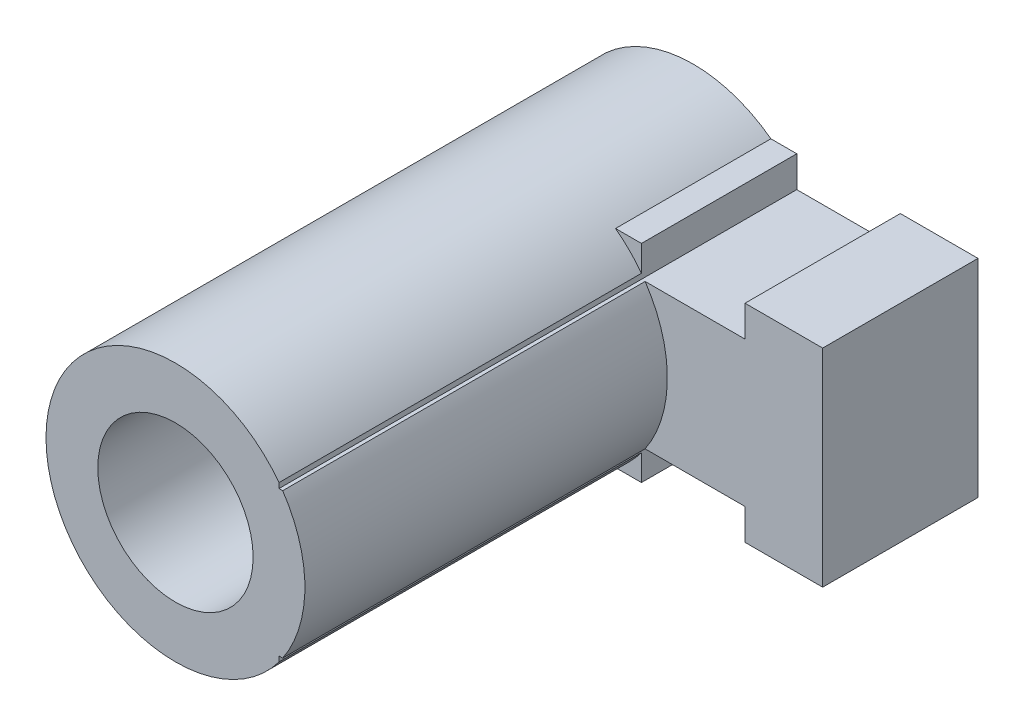
ISO-10303-21;
HEADER;
FILE_DESCRIPTION(('STEP AP214'),'2;1');
FILE_NAME('part.step','',(''),(''),'','','');
FILE_SCHEMA(('AUTOMOTIVE_DESIGN { 1 0 10303 214 1 1 1 1 }'));
ENDSEC;
DATA;
#1=APPLICATION_CONTEXT('core data for automotive mechanical design processes');
#2=APPLICATION_PROTOCOL_DEFINITION('international standard','automotive_design',2000,#1);
#3=PRODUCT_CONTEXT('',#1,'mechanical');
#4=PRODUCT('Part','Part','',(#3));
#5=PRODUCT_RELATED_PRODUCT_CATEGORY('part','',(#4));
#6=PRODUCT_DEFINITION_FORMATION('','',#4);
#7=PRODUCT_DEFINITION_CONTEXT('part definition',#1,'design');
#8=PRODUCT_DEFINITION('design','',#6,#7);
#9=PRODUCT_DEFINITION_SHAPE('','',#8);
#10=(LENGTH_UNIT() NAMED_UNIT(*) SI_UNIT(.MILLI.,.METRE.));
#11=(NAMED_UNIT(*) PLANE_ANGLE_UNIT() SI_UNIT($,.RADIAN.));
#12=(NAMED_UNIT(*) SI_UNIT($,.STERADIAN.) SOLID_ANGLE_UNIT());
#13=UNCERTAINTY_MEASURE_WITH_UNIT(LENGTH_MEASURE(1.E-05),#10,'distance_accuracy_value','');
#14=(GEOMETRIC_REPRESENTATION_CONTEXT(3) GLOBAL_UNCERTAINTY_ASSIGNED_CONTEXT((#13)) GLOBAL_UNIT_ASSIGNED_CONTEXT((#10,
#11,#12)) REPRESENTATION_CONTEXT('',''));
#15=CARTESIAN_POINT('',(0.,0.,0.));
#16=DIRECTION('',(0.,0.,1.));
#17=DIRECTION('',(1.,0.,0.));
#18=AXIS2_PLACEMENT_3D('',#15,#16,#17);
#19=CARTESIAN_POINT('',(0.,0.,3.));
#20=DIRECTION('',(0.,0.,-1.));
#21=DIRECTION('',(-1.,0.,0.));
#22=AXIS2_PLACEMENT_3D('',#19,#20,#21);
#23=PLANE('',#22);
#24=CARTESIAN_POINT('',(0.,0.,3.));
#25=DIRECTION('',(0.,0.,-1.));
#26=DIRECTION('',(-1.,0.,0.));
#27=AXIS2_PLACEMENT_3D('',#24,#25,#26);
#28=CIRCLE('',#27,2.5);
#29=CARTESIAN_POINT('',(1.5,2.,3.));
#30=VERTEX_POINT('',#29);
#31=CARTESIAN_POINT('',(2.,1.5,3.));
#32=VERTEX_POINT('',#31);
#33=EDGE_CURVE('E249',#30,#32,#28,.T.);
#34=ORIENTED_EDGE('',*,*,#33,.T.);
#35=DIRECTION('',(0.,1.,0.));
#36=VECTOR('',#35,1.);
#37=CARTESIAN_POINT('',(2.,0.,3.));
#38=LINE('',#37,#36);
#39=CARTESIAN_POINT('',(2.,2.,3.));
#40=VERTEX_POINT('',#39);
#41=EDGE_CURVE('E180',#32,#40,#38,.T.);
#42=ORIENTED_EDGE('',*,*,#41,.T.);
#43=DIRECTION('',(1.,0.,0.));
#44=VECTOR('',#43,1.);
#45=CARTESIAN_POINT('',(1.5,2.,3.));
#46=LINE('',#45,#44);
#47=EDGE_CURVE('E216',#30,#40,#46,.T.);
#48=ORIENTED_EDGE('',*,*,#47,.F.);
#49=EDGE_LOOP('',(#34,#42,#48));
#50=FACE_BOUND('',#49,.T.);
#51=ADVANCED_FACE('F35',(#50),#23,.F.);
#52=CARTESIAN_POINT('',(0.,0.,10.));
#53=DIRECTION('',(0.,0.,-1.));
#54=DIRECTION('',(-1.,0.,0.));
#55=AXIS2_PLACEMENT_3D('',#52,#53,#54);
#56=CYLINDRICAL_SURFACE('',#55,2.5);
#57=CARTESIAN_POINT('',(0.,0.,10.));
#58=DIRECTION('',(0.,0.,1.));
#59=DIRECTION('',(1.,0.,0.));
#60=AXIS2_PLACEMENT_3D('',#57,#58,#59);
#61=CIRCLE('',#60,2.5);
#62=CARTESIAN_POINT('',(2.,1.5,10.));
#63=VERTEX_POINT('',#62);
#64=CARTESIAN_POINT('',(2.,-1.5,10.));
#65=VERTEX_POINT('',#64);
#66=EDGE_CURVE('E262',#63,#65,#61,.T.);
#67=ORIENTED_EDGE('',*,*,#66,.F.);
#68=DIRECTION('',(0.,0.,-1.));
#69=VECTOR('',#68,1.);
#70=CARTESIAN_POINT('',(2.,1.5,10.));
#71=LINE('',#70,#69);
#72=EDGE_CURVE('E155',#63,#32,#71,.T.);
#73=ORIENTED_EDGE('',*,*,#72,.T.);
#74=ORIENTED_EDGE('',*,*,#33,.F.);
#75=DIRECTION('',(0.,0.,-1.));
#76=VECTOR('',#75,1.);
#77=CARTESIAN_POINT('',(1.5,2.,3.));
#78=LINE('',#77,#76);
#79=CARTESIAN_POINT('',(1.5,2.,0.));
#80=VERTEX_POINT('',#79);
#81=EDGE_CURVE('E227',#30,#80,#78,.T.);
#82=ORIENTED_EDGE('',*,*,#81,.T.);
#83=CARTESIAN_POINT('',(0.,0.,0.));
#84=DIRECTION('',(0.,0.,1.));
#85=DIRECTION('',(1.,0.,0.));
#86=AXIS2_PLACEMENT_3D('',#83,#84,#85);
#87=CIRCLE('',#86,2.5);
#88=CARTESIAN_POINT('',(1.5,-2.,0.));
#89=VERTEX_POINT('',#88);
#90=EDGE_CURVE('E257',#80,#89,#87,.T.);
#91=ORIENTED_EDGE('',*,*,#90,.T.);
#92=DIRECTION('',(0.,0.,-1.));
#93=VECTOR('',#92,1.);
#94=CARTESIAN_POINT('',(1.5,-2.,3.));
#95=LINE('',#94,#93);
#96=CARTESIAN_POINT('',(1.5,-2.,3.));
#97=VERTEX_POINT('',#96);
#98=EDGE_CURVE('E238',#97,#89,#95,.T.);
#99=ORIENTED_EDGE('',*,*,#98,.F.);
#100=CARTESIAN_POINT('',(2.,-1.5,3.));
#101=VERTEX_POINT('',#100);
#102=EDGE_CURVE('E241',#101,#97,#28,.T.);
#103=ORIENTED_EDGE('',*,*,#102,.F.);
#104=DIRECTION('',(0.,0.,-1.));
#105=VECTOR('',#104,1.);
#106=CARTESIAN_POINT('',(2.,-1.5,10.));
#107=LINE('',#106,#105);
#108=EDGE_CURVE('E58',#101,#65,#107,.F.);
#109=ORIENTED_EDGE('',*,*,#108,.T.);
#110=EDGE_LOOP('',(#67,#73,#74,#82,#91,#99,#103,#109));
#111=FACE_BOUND('',#110,.T.);
#112=ADVANCED_FACE('F312',(#111),#56,.T.);
#113=CARTESIAN_POINT('',(1.5,2.,3.));
#114=DIRECTION('',(0.,1.,0.));
#115=DIRECTION('',(-1.,0.,0.));
#116=AXIS2_PLACEMENT_3D('',#113,#114,#115);
#117=PLANE('',#116);
#118=DIRECTION('',(0.,0.,-1.));
#119=VECTOR('',#118,1.);
#120=CARTESIAN_POINT('',(4.,2.,3.));
#121=LINE('',#120,#119);
#122=CARTESIAN_POINT('',(4.,2.,3.));
#123=VERTEX_POINT('',#122);
#124=CARTESIAN_POINT('',(4.,2.,0.));
#125=VERTEX_POINT('',#124);
#126=EDGE_CURVE('E43',#123,#125,#121,.T.);
#127=ORIENTED_EDGE('',*,*,#126,.F.);
#128=CARTESIAN_POINT('',(5.5,2.,3.));
#129=VERTEX_POINT('',#128);
#130=EDGE_CURVE('E220',#123,#129,#46,.T.);
#131=ORIENTED_EDGE('',*,*,#130,.T.);
#132=DIRECTION('',(0.,0.,-1.));
#133=VECTOR('',#132,1.);
#134=CARTESIAN_POINT('',(5.5,2.,3.));
#135=LINE('',#134,#133);
#136=CARTESIAN_POINT('',(5.5,2.,0.));
#137=VERTEX_POINT('',#136);
#138=EDGE_CURVE('E244',#129,#137,#135,.T.);
#139=ORIENTED_EDGE('',*,*,#138,.T.);
#140=DIRECTION('',(1.,0.,0.));
#141=VECTOR('',#140,1.);
#142=CARTESIAN_POINT('',(1.5,2.,0.));
#143=LINE('',#142,#141);
#144=EDGE_CURVE('E215',#125,#137,#143,.T.);
#145=ORIENTED_EDGE('',*,*,#144,.F.);
#146=EDGE_LOOP('',(#127,#131,#139,#145));
#147=FACE_BOUND('',#146,.T.);
#148=ADVANCED_FACE('F283',(#147),#117,.T.);
#149=CARTESIAN_POINT('',(1.5,-2.,3.));
#150=DIRECTION('',(0.,-1.,0.));
#151=DIRECTION('',(1.,0.,0.));
#152=AXIS2_PLACEMENT_3D('',#149,#150,#151);
#153=PLANE('',#152);
#154=DIRECTION('',(0.,0.,-1.));
#155=VECTOR('',#154,1.);
#156=CARTESIAN_POINT('',(4.,-2.,10.));
#157=LINE('',#156,#155);
#158=CARTESIAN_POINT('',(4.,-2.,3.));
#159=VERTEX_POINT('',#158);
#160=CARTESIAN_POINT('',(4.,-2.,0.));
#161=VERTEX_POINT('',#160);
#162=EDGE_CURVE('E196',#159,#161,#157,.T.);
#163=ORIENTED_EDGE('',*,*,#162,.T.);
#164=DIRECTION('',(-1.,0.,0.));
#165=VECTOR('',#164,1.);
#166=CARTESIAN_POINT('',(1.5,-2.,0.));
#167=LINE('',#166,#165);
#168=CARTESIAN_POINT('',(5.5,-2.,0.));
#169=VERTEX_POINT('',#168);
#170=EDGE_CURVE('E235',#169,#161,#167,.T.);
#171=ORIENTED_EDGE('',*,*,#170,.F.);
#172=DIRECTION('',(0.,0.,-1.));
#173=VECTOR('',#172,1.);
#174=CARTESIAN_POINT('',(5.5,-2.,3.));
#175=LINE('',#174,#173);
#176=CARTESIAN_POINT('',(5.5,-2.,3.));
#177=VERTEX_POINT('',#176);
#178=EDGE_CURVE('E242',#177,#169,#175,.T.);
#179=ORIENTED_EDGE('',*,*,#178,.F.);
#180=DIRECTION('',(-1.,0.,0.));
#181=VECTOR('',#180,1.);
#182=CARTESIAN_POINT('',(1.5,-2.,3.));
#183=LINE('',#182,#181);
#184=EDGE_CURVE('E224',#177,#159,#183,.T.);
#185=ORIENTED_EDGE('',*,*,#184,.T.);
#186=EDGE_LOOP('',(#163,#171,#179,#185));
#187=FACE_BOUND('',#186,.T.);
#188=ADVANCED_FACE('F292',(#187),#153,.T.);
#189=ORIENTED_EDGE('',*,*,#130,.F.);
#190=DIRECTION('',(0.,-1.,0.));
#191=VECTOR('',#190,1.);
#192=CARTESIAN_POINT('',(4.,0.,3.));
#193=LINE('',#192,#191);
#194=CARTESIAN_POINT('',(4.,1.4,3.));
#195=VERTEX_POINT('',#194);
#196=EDGE_CURVE('E183',#123,#195,#193,.T.);
#197=ORIENTED_EDGE('',*,*,#196,.T.);
#198=DIRECTION('',(-1.,0.,0.));
#199=VECTOR('',#198,1.);
#200=CARTESIAN_POINT('',(0.,1.4,3.));
#201=LINE('',#200,#199);
#202=CARTESIAN_POINT('',(2.0712315177208,1.4,3.));
#203=VERTEX_POINT('',#202);
#204=EDGE_CURVE('E186',#195,#203,#201,.T.);
#205=ORIENTED_EDGE('',*,*,#204,.T.);
#206=CARTESIAN_POINT('',(2.0712315177208,-1.4,3.));
#207=VERTEX_POINT('',#206);
#208=EDGE_CURVE('E253',#203,#207,#28,.T.);
#209=ORIENTED_EDGE('',*,*,#208,.T.);
#210=DIRECTION('',(1.,0.,0.));
#211=VECTOR('',#210,1.);
#212=CARTESIAN_POINT('',(0.,-1.4,3.));
#213=LINE('',#212,#211);
#214=CARTESIAN_POINT('',(4.,-1.4,3.));
#215=VERTEX_POINT('',#214);
#216=EDGE_CURVE('E266',#207,#215,#213,.T.);
#217=ORIENTED_EDGE('',*,*,#216,.T.);
#218=DIRECTION('',(0.,-1.,0.));
#219=VECTOR('',#218,1.);
#220=CARTESIAN_POINT('',(4.,0.,3.));
#221=LINE('',#220,#219);
#222=EDGE_CURVE('E269',#215,#159,#221,.T.);
#223=ORIENTED_EDGE('',*,*,#222,.T.);
#224=ORIENTED_EDGE('',*,*,#184,.F.);
#225=DIRECTION('',(0.,-1.,0.));
#226=VECTOR('',#225,1.);
#227=CARTESIAN_POINT('',(5.5,-2.,3.));
#228=LINE('',#227,#226);
#229=EDGE_CURVE('E219',#129,#177,#228,.T.);
#230=ORIENTED_EDGE('',*,*,#229,.F.);
#231=EDGE_LOOP('',(#189,#197,#205,#209,#217,#223,#224,#230));
#232=FACE_BOUND('',#231,.T.);
#233=ADVANCED_FACE('F298',(#232),#23,.F.);
#234=CARTESIAN_POINT('',(0.,0.,10.));
#235=DIRECTION('',(0.,0.,1.));
#236=DIRECTION('',(1.,0.,0.));
#237=AXIS2_PLACEMENT_3D('',#234,#235,#236);
#238=PLANE('',#237);
#239=DIRECTION('',(0.,1.,0.));
#240=VECTOR('',#239,1.);
#241=CARTESIAN_POINT('',(2.,2.,10.));
#242=LINE('',#241,#240);
#243=CARTESIAN_POINT('',(2.,1.4,10.));
#244=VERTEX_POINT('',#243);
#245=EDGE_CURVE('E159',#244,#63,#242,.T.);
#246=ORIENTED_EDGE('',*,*,#245,.T.);
#247=ORIENTED_EDGE('',*,*,#66,.T.);
#248=DIRECTION('',(0.,1.,0.));
#249=VECTOR('',#248,1.);
#250=CARTESIAN_POINT('',(2.,-2.,10.));
#251=LINE('',#250,#249);
#252=CARTESIAN_POINT('',(2.,-1.4,10.));
#253=VERTEX_POINT('',#252);
#254=EDGE_CURVE('E190',#65,#253,#251,.T.);
#255=ORIENTED_EDGE('',*,*,#254,.T.);
#256=DIRECTION('',(1.,0.,0.));
#257=VECTOR('',#256,1.);
#258=CARTESIAN_POINT('',(4.,-1.4,10.));
#259=LINE('',#258,#257);
#260=CARTESIAN_POINT('',(2.0712315177208,-1.4,10.));
#261=VERTEX_POINT('',#260);
#262=EDGE_CURVE('E193',#253,#261,#259,.T.);
#263=ORIENTED_EDGE('',*,*,#262,.T.);
#264=CARTESIAN_POINT('',(2.0712315177208,1.4,10.));
#265=VERTEX_POINT('',#264);
#266=EDGE_CURVE('E170',#261,#265,#61,.T.);
#267=ORIENTED_EDGE('',*,*,#266,.T.);
#268=DIRECTION('',(-1.,0.,0.));
#269=VECTOR('',#268,1.);
#270=CARTESIAN_POINT('',(4.,1.4,10.));
#271=LINE('',#270,#269);
#272=EDGE_CURVE('E152',#265,#244,#271,.T.);
#273=ORIENTED_EDGE('',*,*,#272,.T.);
#274=EDGE_LOOP('',(#246,#247,#255,#263,#267,#273));
#275=FACE_BOUND('',#274,.T.);
#276=CARTESIAN_POINT('',(0.,0.,10.));
#277=DIRECTION('',(0.,0.,1.));
#278=DIRECTION('',(1.,0.,0.));
#279=AXIS2_PLACEMENT_3D('',#276,#277,#278);
#280=CIRCLE('',#279,1.5);
#281=CARTESIAN_POINT('',(1.5,0.,10.));
#282=VERTEX_POINT('',#281);
#283=EDGE_CURVE('E254',#282,#282,#280,.T.);
#284=ORIENTED_EDGE('',*,*,#283,.F.);
#285=EDGE_LOOP('',(#284));
#286=FACE_BOUND('',#285,.T.);
#287=ADVANCED_FACE('F166',(#275,#286),#238,.T.);
#288=CARTESIAN_POINT('',(0.,0.,0.));
#289=DIRECTION('',(0.,0.,1.));
#290=DIRECTION('',(1.,0.,0.));
#291=AXIS2_PLACEMENT_3D('',#288,#289,#290);
#292=PLANE('',#291);
#293=CARTESIAN_POINT('',(0.,0.,0.));
#294=DIRECTION('',(0.,0.,1.));
#295=DIRECTION('',(1.,0.,0.));
#296=AXIS2_PLACEMENT_3D('',#293,#294,#295);
#297=CIRCLE('',#296,1.5);
#298=CARTESIAN_POINT('',(1.5,0.,0.));
#299=VERTEX_POINT('',#298);
#300=EDGE_CURVE('E252',#299,#299,#297,.T.);
#301=ORIENTED_EDGE('',*,*,#300,.T.);
#302=EDGE_LOOP('',(#301));
#303=FACE_BOUND('',#302,.T.);
#304=DIRECTION('',(-1.,0.,0.));
#305=VECTOR('',#304,1.);
#306=CARTESIAN_POINT('',(4.,1.4,0.));
#307=LINE('',#306,#305);
#308=CARTESIAN_POINT('',(4.,1.4,0.));
#309=VERTEX_POINT('',#308);
#310=CARTESIAN_POINT('',(2.,1.4,0.));
#311=VERTEX_POINT('',#310);
#312=EDGE_CURVE('E154',#309,#311,#307,.T.);
#313=ORIENTED_EDGE('',*,*,#312,.F.);
#314=DIRECTION('',(0.,-1.,0.));
#315=VECTOR('',#314,1.);
#316=CARTESIAN_POINT('',(4.,2.,0.));
#317=LINE('',#316,#315);
#318=EDGE_CURVE('E174',#125,#309,#317,.T.);
#319=ORIENTED_EDGE('',*,*,#318,.F.);
#320=ORIENTED_EDGE('',*,*,#144,.T.);
#321=DIRECTION('',(0.,-1.,0.));
#322=VECTOR('',#321,1.);
#323=CARTESIAN_POINT('',(5.5,-2.,0.));
#324=LINE('',#323,#322);
#325=EDGE_CURVE('E231',#137,#169,#324,.T.);
#326=ORIENTED_EDGE('',*,*,#325,.T.);
#327=ORIENTED_EDGE('',*,*,#170,.T.);
#328=DIRECTION('',(0.,-1.,0.));
#329=VECTOR('',#328,1.);
#330=CARTESIAN_POINT('',(4.,-2.,0.));
#331=LINE('',#330,#329);
#332=CARTESIAN_POINT('',(4.,-1.4,0.));
#333=VERTEX_POINT('',#332);
#334=EDGE_CURVE('E189',#333,#161,#331,.T.);
#335=ORIENTED_EDGE('',*,*,#334,.F.);
#336=DIRECTION('',(1.,0.,0.));
#337=VECTOR('',#336,1.);
#338=CARTESIAN_POINT('',(4.,-1.4,0.));
#339=LINE('',#338,#337);
#340=CARTESIAN_POINT('',(2.,-1.4,0.));
#341=VERTEX_POINT('',#340);
#342=EDGE_CURVE('E194',#341,#333,#339,.T.);
#343=ORIENTED_EDGE('',*,*,#342,.F.);
#344=DIRECTION('',(0.,1.,0.));
#345=VECTOR('',#344,1.);
#346=CARTESIAN_POINT('',(2.,-2.,0.));
#347=LINE('',#346,#345);
#348=CARTESIAN_POINT('',(2.,-2.,0.));
#349=VERTEX_POINT('',#348);
#350=EDGE_CURVE('E198',#349,#341,#347,.T.);
#351=ORIENTED_EDGE('',*,*,#350,.F.);
#352=EDGE_CURVE('E234',#349,#89,#167,.T.);
#353=ORIENTED_EDGE('',*,*,#352,.T.);
#354=ORIENTED_EDGE('',*,*,#90,.F.);
#355=CARTESIAN_POINT('',(2.,2.,0.));
#356=VERTEX_POINT('',#355);
#357=EDGE_CURVE('E228',#80,#356,#143,.T.);
#358=ORIENTED_EDGE('',*,*,#357,.T.);
#359=DIRECTION('',(0.,1.,0.));
#360=VECTOR('',#359,1.);
#361=CARTESIAN_POINT('',(2.,2.,0.));
#362=LINE('',#361,#360);
#363=EDGE_CURVE('E50',#311,#356,#362,.T.);
#364=ORIENTED_EDGE('',*,*,#363,.F.);
#365=EDGE_LOOP('',(#313,#319,#320,#326,#327,#335,#343,#351,#353,#354,#358,#364));
#366=FACE_BOUND('',#365,.T.);
#367=ADVANCED_FACE('F282',(#303,#366),#292,.F.);
#368=ORIENTED_EDGE('',*,*,#208,.F.);
#369=DIRECTION('',(0.,0.,-1.));
#370=VECTOR('',#369,1.);
#371=CARTESIAN_POINT('',(2.0712315177208,1.4,10.));
#372=LINE('',#371,#370);
#373=EDGE_CURVE('E11',#203,#265,#372,.F.);
#374=ORIENTED_EDGE('',*,*,#373,.T.);
#375=ORIENTED_EDGE('',*,*,#266,.F.);
#376=DIRECTION('',(0.,0.,-1.));
#377=VECTOR('',#376,1.);
#378=CARTESIAN_POINT('',(2.0712315177208,-1.4,10.));
#379=LINE('',#378,#377);
#380=EDGE_CURVE('E212',#261,#207,#379,.T.);
#381=ORIENTED_EDGE('',*,*,#380,.T.);
#382=EDGE_LOOP('',(#368,#374,#375,#381));
#383=FACE_BOUND('',#382,.T.);
#384=ADVANCED_FACE('F37',(#383),#56,.T.);
#385=CARTESIAN_POINT('',(0.,0.,10.));
#386=DIRECTION('',(0.,0.,-1.));
#387=DIRECTION('',(-1.,0.,0.));
#388=AXIS2_PLACEMENT_3D('',#385,#386,#387);
#389=CYLINDRICAL_SURFACE('',#388,1.5);
#390=ORIENTED_EDGE('',*,*,#300,.F.);
#391=EDGE_LOOP('',(#390));
#392=FACE_BOUND('',#391,.T.);
#393=ORIENTED_EDGE('',*,*,#283,.T.);
#394=EDGE_LOOP('',(#393));
#395=FACE_BOUND('',#394,.T.);
#396=ADVANCED_FACE('F352',(#392,#395),#389,.F.);
#397=DIRECTION('',(0.,0.,-1.));
#398=VECTOR('',#397,1.);
#399=CARTESIAN_POINT('',(2.,-2.,10.));
#400=LINE('',#399,#398);
#401=CARTESIAN_POINT('',(2.,-2.,3.));
#402=VERTEX_POINT('',#401);
#403=EDGE_CURVE('E207',#402,#349,#400,.T.);
#404=ORIENTED_EDGE('',*,*,#403,.F.);
#405=EDGE_CURVE('E223',#402,#97,#183,.T.);
#406=ORIENTED_EDGE('',*,*,#405,.T.);
#407=ORIENTED_EDGE('',*,*,#98,.T.);
#408=ORIENTED_EDGE('',*,*,#352,.F.);
#409=EDGE_LOOP('',(#404,#406,#407,#408));
#410=FACE_BOUND('',#409,.T.);
#411=ADVANCED_FACE('F316',(#410),#153,.T.);
#412=CARTESIAN_POINT('',(5.5,-2.,3.));
#413=DIRECTION('',(1.,0.,0.));
#414=DIRECTION('',(0.,0.,-1.));
#415=AXIS2_PLACEMENT_3D('',#412,#413,#414);
#416=PLANE('',#415);
#417=ORIENTED_EDGE('',*,*,#325,.F.);
#418=ORIENTED_EDGE('',*,*,#138,.F.);
#419=ORIENTED_EDGE('',*,*,#229,.T.);
#420=ORIENTED_EDGE('',*,*,#178,.T.);
#421=EDGE_LOOP('',(#417,#418,#419,#420));
#422=FACE_BOUND('',#421,.T.);
#423=ADVANCED_FACE('F288',(#422),#416,.T.);
#424=DIRECTION('',(0.,0.,1.));
#425=VECTOR('',#424,1.);
#426=CARTESIAN_POINT('',(2.,2.,3.));
#427=LINE('',#426,#425);
#428=EDGE_CURVE('E272',#356,#40,#427,.T.);
#429=ORIENTED_EDGE('',*,*,#428,.F.);
#430=ORIENTED_EDGE('',*,*,#357,.F.);
#431=ORIENTED_EDGE('',*,*,#81,.F.);
#432=ORIENTED_EDGE('',*,*,#47,.T.);
#433=EDGE_LOOP('',(#429,#430,#431,#432));
#434=FACE_BOUND('',#433,.T.);
#435=ADVANCED_FACE('F324',(#434),#117,.T.);
#436=ORIENTED_EDGE('',*,*,#405,.F.);
#437=DIRECTION('',(0.,1.,0.));
#438=VECTOR('',#437,1.);
#439=CARTESIAN_POINT('',(2.,0.,3.));
#440=LINE('',#439,#438);
#441=EDGE_CURVE('E261',#402,#101,#440,.T.);
#442=ORIENTED_EDGE('',*,*,#441,.T.);
#443=ORIENTED_EDGE('',*,*,#102,.T.);
#444=EDGE_LOOP('',(#436,#442,#443));
#445=FACE_BOUND('',#444,.T.);
#446=ADVANCED_FACE('F310',(#445),#23,.F.);
#447=CARTESIAN_POINT('',(4.,-2.,10.));
#448=DIRECTION('',(1.,0.,0.));
#449=DIRECTION('',(0.,0.,-1.));
#450=AXIS2_PLACEMENT_3D('',#447,#448,#449);
#451=PLANE('',#450);
#452=DIRECTION('',(0.,0.,-1.));
#453=VECTOR('',#452,1.);
#454=CARTESIAN_POINT('',(4.,-1.4,10.));
#455=LINE('',#454,#453);
#456=EDGE_CURVE('E203',#215,#333,#455,.T.);
#457=ORIENTED_EDGE('',*,*,#456,.T.);
#458=ORIENTED_EDGE('',*,*,#334,.T.);
#459=ORIENTED_EDGE('',*,*,#162,.F.);
#460=ORIENTED_EDGE('',*,*,#222,.F.);
#461=EDGE_LOOP('',(#457,#458,#459,#460));
#462=FACE_BOUND('',#461,.T.);
#463=ADVANCED_FACE('F295',(#462),#451,.F.);
#464=CARTESIAN_POINT('',(4.,-1.4,10.));
#465=DIRECTION('',(0.,1.,0.));
#466=DIRECTION('',(0.,0.,1.));
#467=AXIS2_PLACEMENT_3D('',#464,#465,#466);
#468=PLANE('',#467);
#469=ORIENTED_EDGE('',*,*,#262,.F.);
#470=DIRECTION('',(0.,0.,-1.));
#471=VECTOR('',#470,1.);
#472=CARTESIAN_POINT('',(2.,-1.4,10.));
#473=LINE('',#472,#471);
#474=EDGE_CURVE('E205',#253,#341,#473,.T.);
#475=ORIENTED_EDGE('',*,*,#474,.T.);
#476=ORIENTED_EDGE('',*,*,#342,.T.);
#477=ORIENTED_EDGE('',*,*,#456,.F.);
#478=ORIENTED_EDGE('',*,*,#216,.F.);
#479=ORIENTED_EDGE('',*,*,#380,.F.);
#480=EDGE_LOOP('',(#469,#475,#476,#477,#478,#479));
#481=FACE_BOUND('',#480,.T.);
#482=ADVANCED_FACE('F303',(#481),#468,.F.);
#483=CARTESIAN_POINT('',(2.,-2.,10.));
#484=DIRECTION('',(-1.,0.,0.));
#485=DIRECTION('',(0.,0.,1.));
#486=AXIS2_PLACEMENT_3D('',#483,#484,#485);
#487=PLANE('',#486);
#488=ORIENTED_EDGE('',*,*,#441,.F.);
#489=ORIENTED_EDGE('',*,*,#403,.T.);
#490=ORIENTED_EDGE('',*,*,#350,.T.);
#491=ORIENTED_EDGE('',*,*,#474,.F.);
#492=ORIENTED_EDGE('',*,*,#254,.F.);
#493=ORIENTED_EDGE('',*,*,#108,.F.);
#494=EDGE_LOOP('',(#488,#489,#490,#491,#492,#493));
#495=FACE_BOUND('',#494,.T.);
#496=ADVANCED_FACE('F318',(#495),#487,.F.);
#497=CARTESIAN_POINT('',(4.,1.4,10.));
#498=DIRECTION('',(0.,-1.,0.));
#499=DIRECTION('',(0.,0.,-1.));
#500=AXIS2_PLACEMENT_3D('',#497,#498,#499);
#501=PLANE('',#500);
#502=DIRECTION('',(0.,0.,-1.));
#503=VECTOR('',#502,1.);
#504=CARTESIAN_POINT('',(4.,1.4,10.));
#505=LINE('',#504,#503);
#506=EDGE_CURVE('E156',#195,#309,#505,.T.);
#507=ORIENTED_EDGE('',*,*,#506,.T.);
#508=ORIENTED_EDGE('',*,*,#312,.T.);
#509=DIRECTION('',(0.,0.,-1.));
#510=VECTOR('',#509,1.);
#511=CARTESIAN_POINT('',(2.,1.4,10.));
#512=LINE('',#511,#510);
#513=EDGE_CURVE('E148',#244,#311,#512,.T.);
#514=ORIENTED_EDGE('',*,*,#513,.F.);
#515=ORIENTED_EDGE('',*,*,#272,.F.);
#516=ORIENTED_EDGE('',*,*,#373,.F.);
#517=ORIENTED_EDGE('',*,*,#204,.F.);
#518=EDGE_LOOP('',(#507,#508,#514,#515,#516,#517));
#519=FACE_BOUND('',#518,.T.);
#520=ADVANCED_FACE('F150',(#519),#501,.F.);
#521=CARTESIAN_POINT('',(4.,2.,10.));
#522=DIRECTION('',(1.,0.,0.));
#523=DIRECTION('',(0.,0.,-1.));
#524=AXIS2_PLACEMENT_3D('',#521,#522,#523);
#525=PLANE('',#524);
#526=ORIENTED_EDGE('',*,*,#126,.T.);
#527=ORIENTED_EDGE('',*,*,#318,.T.);
#528=ORIENTED_EDGE('',*,*,#506,.F.);
#529=ORIENTED_EDGE('',*,*,#196,.F.);
#530=EDGE_LOOP('',(#526,#527,#528,#529));
#531=FACE_BOUND('',#530,.T.);
#532=ADVANCED_FACE('F276',(#531),#525,.F.);
#533=CARTESIAN_POINT('',(2.,2.,10.));
#534=DIRECTION('',(-1.,0.,0.));
#535=DIRECTION('',(0.,-1.,0.));
#536=AXIS2_PLACEMENT_3D('',#533,#534,#535);
#537=PLANE('',#536);
#538=ORIENTED_EDGE('',*,*,#72,.F.);
#539=ORIENTED_EDGE('',*,*,#245,.F.);
#540=ORIENTED_EDGE('',*,*,#513,.T.);
#541=ORIENTED_EDGE('',*,*,#363,.T.);
#542=ORIENTED_EDGE('',*,*,#428,.T.);
#543=ORIENTED_EDGE('',*,*,#41,.F.);
#544=EDGE_LOOP('',(#538,#539,#540,#541,#542,#543));
#545=FACE_BOUND('',#544,.T.);
#546=ADVANCED_FACE('F160',(#545),#537,.F.);
#547=CLOSED_SHELL('',(#51,#112,#148,#188,#233,#287,#367,#384,#396,#411,#423,#435,#446,#463,#482,
#496,#520,#532,#546));
#548=MANIFOLD_SOLID_BREP('B2',#547);
#549=ADVANCED_BREP_SHAPE_REPRESENTATION('',(#18,#548),#14);
#550=SHAPE_DEFINITION_REPRESENTATION(#9,#549);
ENDSEC;
END-ISO-10303-21;
